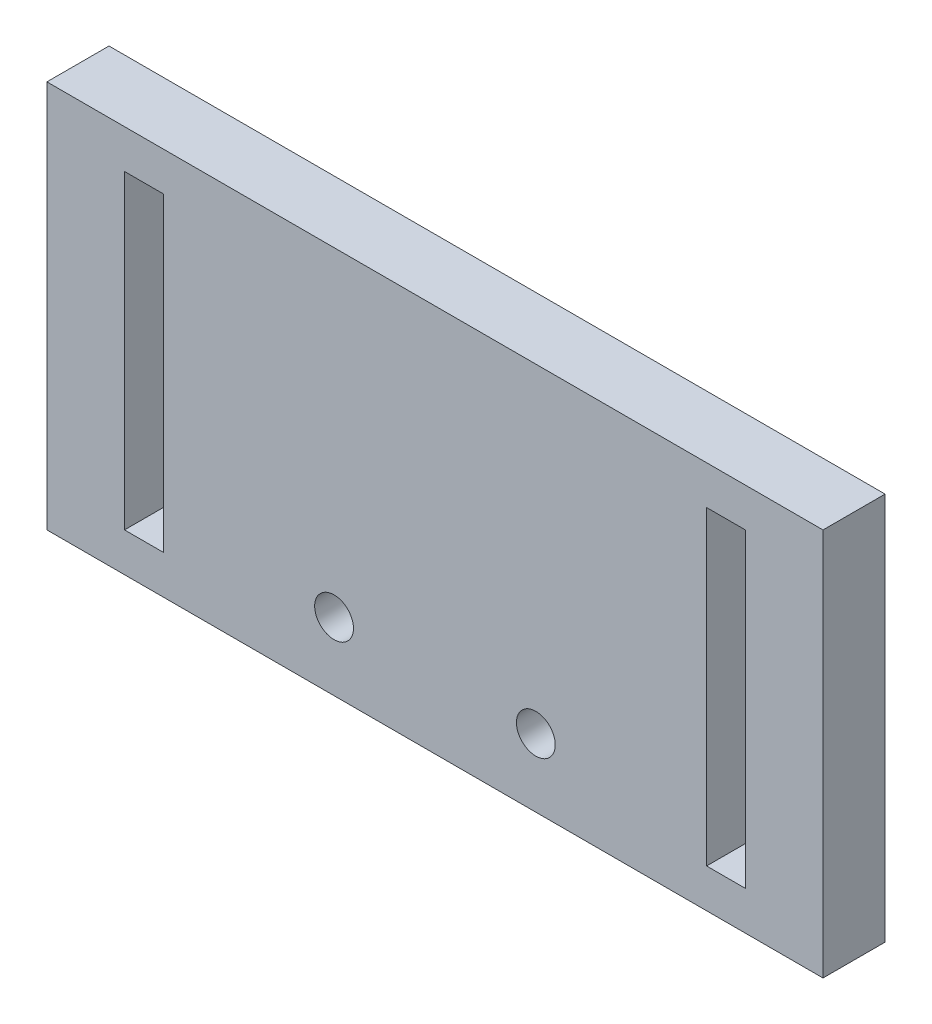
ISO-10303-21;
HEADER;
FILE_DESCRIPTION(('STEP AP214'),'2;1');
FILE_NAME('part.step','',(''),(''),'','','');
FILE_SCHEMA(('AUTOMOTIVE_DESIGN { 1 0 10303 214 1 1 1 1 }'));
ENDSEC;
DATA;
#1=APPLICATION_CONTEXT('core data for automotive mechanical design processes');
#2=APPLICATION_PROTOCOL_DEFINITION('international standard','automotive_design',2000,#1);
#3=PRODUCT_CONTEXT('',#1,'mechanical');
#4=PRODUCT('Part','Part','',(#3));
#5=PRODUCT_RELATED_PRODUCT_CATEGORY('part','',(#4));
#6=PRODUCT_DEFINITION_FORMATION('','',#4);
#7=PRODUCT_DEFINITION_CONTEXT('part definition',#1,'design');
#8=PRODUCT_DEFINITION('design','',#6,#7);
#9=PRODUCT_DEFINITION_SHAPE('','',#8);
#10=(LENGTH_UNIT() NAMED_UNIT(*) SI_UNIT(.MILLI.,.METRE.));
#11=(NAMED_UNIT(*) PLANE_ANGLE_UNIT() SI_UNIT($,.RADIAN.));
#12=(NAMED_UNIT(*) SI_UNIT($,.STERADIAN.) SOLID_ANGLE_UNIT());
#13=UNCERTAINTY_MEASURE_WITH_UNIT(LENGTH_MEASURE(1.E-05),#10,'distance_accuracy_value','');
#14=(GEOMETRIC_REPRESENTATION_CONTEXT(3) GLOBAL_UNCERTAINTY_ASSIGNED_CONTEXT((#13)) GLOBAL_UNIT_ASSIGNED_CONTEXT((#10,
#11,#12)) REPRESENTATION_CONTEXT('',''));
#15=CARTESIAN_POINT('',(0.,0.,0.));
#16=DIRECTION('',(0.,0.,1.));
#17=DIRECTION('',(1.,0.,0.));
#18=AXIS2_PLACEMENT_3D('',#15,#16,#17);
#19=CARTESIAN_POINT('',(0.,0.,8.));
#20=DIRECTION('',(0.,0.,1.));
#21=DIRECTION('',(1.,0.,0.));
#22=AXIS2_PLACEMENT_3D('',#19,#20,#21);
#23=PLANE('',#22);
#24=CARTESIAN_POINT('',(-13.,-16.2441684933035,8.));
#25=DIRECTION('',(0.,0.,1.));
#26=DIRECTION('',(1.,0.,0.));
#27=AXIS2_PLACEMENT_3D('',#24,#25,#26);
#28=CIRCLE('',#27,2.5);
#29=CARTESIAN_POINT('',(-10.5,-16.2441684933035,8.));
#30=VERTEX_POINT('',#29);
#31=EDGE_CURVE('E167',#30,#30,#28,.T.);
#32=ORIENTED_EDGE('',*,*,#31,.F.);
#33=EDGE_LOOP('',(#32));
#34=FACE_BOUND('',#33,.T.);
#35=DIRECTION('',(0.,-1.,0.));
#36=VECTOR('',#35,1.);
#37=CARTESIAN_POINT('',(-50.,-25.,8.));
#38=LINE('',#37,#36);
#39=CARTESIAN_POINT('',(-50.,25.,8.));
#40=VERTEX_POINT('',#39);
#41=CARTESIAN_POINT('',(-50.,-25.,8.));
#42=VERTEX_POINT('',#41);
#43=EDGE_CURVE('E226',#40,#42,#38,.T.);
#44=ORIENTED_EDGE('',*,*,#43,.T.);
#45=DIRECTION('',(1.,0.,0.));
#46=VECTOR('',#45,1.);
#47=CARTESIAN_POINT('',(50.,-25.,8.));
#48=LINE('',#47,#46);
#49=CARTESIAN_POINT('',(50.,-25.,8.));
#50=VERTEX_POINT('',#49);
#51=EDGE_CURVE('E230',#42,#50,#48,.T.);
#52=ORIENTED_EDGE('',*,*,#51,.T.);
#53=DIRECTION('',(0.,1.,0.));
#54=VECTOR('',#53,1.);
#55=CARTESIAN_POINT('',(50.,-25.,8.));
#56=LINE('',#55,#54);
#57=CARTESIAN_POINT('',(50.,25.,8.));
#58=VERTEX_POINT('',#57);
#59=EDGE_CURVE('E234',#50,#58,#56,.T.);
#60=ORIENTED_EDGE('',*,*,#59,.T.);
#61=DIRECTION('',(-1.,0.,0.));
#62=VECTOR('',#61,1.);
#63=CARTESIAN_POINT('',(50.,25.,8.));
#64=LINE('',#63,#62);
#65=EDGE_CURVE('E237',#58,#40,#64,.T.);
#66=ORIENTED_EDGE('',*,*,#65,.T.);
#67=EDGE_LOOP('',(#44,#52,#60,#66));
#68=FACE_BOUND('',#67,.T.);
#69=DIRECTION('',(1.,0.,0.));
#70=VECTOR('',#69,1.);
#71=CARTESIAN_POINT('',(-40.,-20.,8.));
#72=LINE('',#71,#70);
#73=CARTESIAN_POINT('',(-40.,-20.,8.));
#74=VERTEX_POINT('',#73);
#75=CARTESIAN_POINT('',(-35.,-20.,8.));
#76=VERTEX_POINT('',#75);
#77=EDGE_CURVE('E186',#74,#76,#72,.T.);
#78=ORIENTED_EDGE('',*,*,#77,.F.);
#79=DIRECTION('',(0.,-1.,0.));
#80=VECTOR('',#79,1.);
#81=CARTESIAN_POINT('',(-40.,20.,8.));
#82=LINE('',#81,#80);
#83=CARTESIAN_POINT('',(-40.,20.,8.));
#84=VERTEX_POINT('',#83);
#85=EDGE_CURVE('E183',#84,#74,#82,.T.);
#86=ORIENTED_EDGE('',*,*,#85,.F.);
#87=DIRECTION('',(-1.,0.,0.));
#88=VECTOR('',#87,1.);
#89=CARTESIAN_POINT('',(-40.,20.,8.));
#90=LINE('',#89,#88);
#91=CARTESIAN_POINT('',(-35.,20.,8.));
#92=VERTEX_POINT('',#91);
#93=EDGE_CURVE('E194',#92,#84,#90,.T.);
#94=ORIENTED_EDGE('',*,*,#93,.F.);
#95=DIRECTION('',(0.,1.,0.));
#96=VECTOR('',#95,1.);
#97=CARTESIAN_POINT('',(-35.,20.,8.));
#98=LINE('',#97,#96);
#99=EDGE_CURVE('E190',#76,#92,#98,.T.);
#100=ORIENTED_EDGE('',*,*,#99,.F.);
#101=EDGE_LOOP('',(#78,#86,#94,#100));
#102=FACE_BOUND('',#101,.T.);
#103=DIRECTION('',(0.,-1.,0.));
#104=VECTOR('',#103,1.);
#105=CARTESIAN_POINT('',(35.,20.,8.));
#106=LINE('',#105,#104);
#107=CARTESIAN_POINT('',(35.,20.,8.));
#108=VERTEX_POINT('',#107);
#109=CARTESIAN_POINT('',(35.,-20.,8.));
#110=VERTEX_POINT('',#109);
#111=EDGE_CURVE('E141',#108,#110,#106,.T.);
#112=ORIENTED_EDGE('',*,*,#111,.F.);
#113=DIRECTION('',(-1.,0.,0.));
#114=VECTOR('',#113,1.);
#115=CARTESIAN_POINT('',(40.,20.,8.));
#116=LINE('',#115,#114);
#117=CARTESIAN_POINT('',(40.,20.,8.));
#118=VERTEX_POINT('',#117);
#119=EDGE_CURVE('E132',#118,#108,#116,.T.);
#120=ORIENTED_EDGE('',*,*,#119,.F.);
#121=DIRECTION('',(0.,1.,0.));
#122=VECTOR('',#121,1.);
#123=CARTESIAN_POINT('',(40.,20.,8.));
#124=LINE('',#123,#122);
#125=CARTESIAN_POINT('',(40.,-20.,8.));
#126=VERTEX_POINT('',#125);
#127=EDGE_CURVE('E159',#126,#118,#124,.T.);
#128=ORIENTED_EDGE('',*,*,#127,.F.);
#129=DIRECTION('',(1.,0.,0.));
#130=VECTOR('',#129,1.);
#131=CARTESIAN_POINT('',(40.,-20.,8.));
#132=LINE('',#131,#130);
#133=EDGE_CURVE('E155',#110,#126,#132,.T.);
#134=ORIENTED_EDGE('',*,*,#133,.F.);
#135=EDGE_LOOP('',(#112,#120,#128,#134));
#136=FACE_BOUND('',#135,.T.);
#137=CARTESIAN_POINT('',(13.,-16.2441684933035,8.));
#138=DIRECTION('',(0.,0.,1.));
#139=DIRECTION('',(1.,0.,0.));
#140=AXIS2_PLACEMENT_3D('',#137,#138,#139);
#141=CIRCLE('',#140,2.5);
#142=CARTESIAN_POINT('',(15.5,-16.2441684933035,8.));
#143=VERTEX_POINT('',#142);
#144=EDGE_CURVE('E354',#143,#143,#141,.T.);
#145=ORIENTED_EDGE('',*,*,#144,.F.);
#146=EDGE_LOOP('',(#145));
#147=FACE_BOUND('',#146,.T.);
#148=ADVANCED_FACE('F42',(#34,#68,#102,#136,#147),#23,.T.);
#149=CARTESIAN_POINT('',(0.,0.,0.));
#150=DIRECTION('',(0.,0.,1.));
#151=DIRECTION('',(1.,0.,0.));
#152=AXIS2_PLACEMENT_3D('',#149,#150,#151);
#153=PLANE('',#152);
#154=DIRECTION('',(0.,-1.,0.));
#155=VECTOR('',#154,1.);
#156=CARTESIAN_POINT('',(-40.,20.,0.));
#157=LINE('',#156,#155);
#158=CARTESIAN_POINT('',(-40.,20.,0.));
#159=VERTEX_POINT('',#158);
#160=CARTESIAN_POINT('',(-40.,-20.,0.));
#161=VERTEX_POINT('',#160);
#162=EDGE_CURVE('E150',#159,#161,#157,.T.);
#163=ORIENTED_EDGE('',*,*,#162,.T.);
#164=DIRECTION('',(1.,0.,0.));
#165=VECTOR('',#164,1.);
#166=CARTESIAN_POINT('',(-40.,-20.,0.));
#167=LINE('',#166,#165);
#168=CARTESIAN_POINT('',(-35.,-20.,0.));
#169=VERTEX_POINT('',#168);
#170=EDGE_CURVE('E201',#161,#169,#167,.T.);
#171=ORIENTED_EDGE('',*,*,#170,.T.);
#172=DIRECTION('',(0.,1.,0.));
#173=VECTOR('',#172,1.);
#174=CARTESIAN_POINT('',(-35.,20.,0.));
#175=LINE('',#174,#173);
#176=CARTESIAN_POINT('',(-35.,20.,0.));
#177=VERTEX_POINT('',#176);
#178=EDGE_CURVE('E205',#169,#177,#175,.T.);
#179=ORIENTED_EDGE('',*,*,#178,.T.);
#180=DIRECTION('',(-1.,0.,0.));
#181=VECTOR('',#180,1.);
#182=CARTESIAN_POINT('',(-40.,20.,0.));
#183=LINE('',#182,#181);
#184=EDGE_CURVE('E187',#177,#159,#183,.T.);
#185=ORIENTED_EDGE('',*,*,#184,.T.);
#186=EDGE_LOOP('',(#163,#171,#179,#185));
#187=FACE_BOUND('',#186,.T.);
#188=DIRECTION('',(0.,-1.,0.));
#189=VECTOR('',#188,1.);
#190=CARTESIAN_POINT('',(-50.,-25.,0.));
#191=LINE('',#190,#189);
#192=CARTESIAN_POINT('',(-50.,25.,0.));
#193=VERTEX_POINT('',#192);
#194=CARTESIAN_POINT('',(-50.,-25.,0.));
#195=VERTEX_POINT('',#194);
#196=EDGE_CURVE('E225',#193,#195,#191,.T.);
#197=ORIENTED_EDGE('',*,*,#196,.F.);
#198=DIRECTION('',(-1.,0.,0.));
#199=VECTOR('',#198,1.);
#200=CARTESIAN_POINT('',(50.,25.,0.));
#201=LINE('',#200,#199);
#202=CARTESIAN_POINT('',(50.,25.,0.));
#203=VERTEX_POINT('',#202);
#204=EDGE_CURVE('E231',#203,#193,#201,.T.);
#205=ORIENTED_EDGE('',*,*,#204,.F.);
#206=DIRECTION('',(0.,1.,0.));
#207=VECTOR('',#206,1.);
#208=CARTESIAN_POINT('',(50.,-25.,0.));
#209=LINE('',#208,#207);
#210=CARTESIAN_POINT('',(50.,-25.,0.));
#211=VERTEX_POINT('',#210);
#212=EDGE_CURVE('E247',#211,#203,#209,.T.);
#213=ORIENTED_EDGE('',*,*,#212,.F.);
#214=DIRECTION('',(1.,0.,0.));
#215=VECTOR('',#214,1.);
#216=CARTESIAN_POINT('',(50.,-25.,0.));
#217=LINE('',#216,#215);
#218=EDGE_CURVE('E244',#195,#211,#217,.T.);
#219=ORIENTED_EDGE('',*,*,#218,.F.);
#220=EDGE_LOOP('',(#197,#205,#213,#219));
#221=FACE_BOUND('',#220,.T.);
#222=DIRECTION('',(-1.,0.,0.));
#223=VECTOR('',#222,1.);
#224=CARTESIAN_POINT('',(40.,20.,0.));
#225=LINE('',#224,#223);
#226=CARTESIAN_POINT('',(40.,20.,0.));
#227=VERTEX_POINT('',#226);
#228=CARTESIAN_POINT('',(35.,20.,0.));
#229=VERTEX_POINT('',#228);
#230=EDGE_CURVE('E66',#227,#229,#225,.T.);
#231=ORIENTED_EDGE('',*,*,#230,.T.);
#232=DIRECTION('',(0.,-1.,0.));
#233=VECTOR('',#232,1.);
#234=CARTESIAN_POINT('',(35.,20.,0.));
#235=LINE('',#234,#233);
#236=CARTESIAN_POINT('',(35.,-20.,0.));
#237=VERTEX_POINT('',#236);
#238=EDGE_CURVE('E148',#229,#237,#235,.T.);
#239=ORIENTED_EDGE('',*,*,#238,.T.);
#240=DIRECTION('',(1.,0.,0.));
#241=VECTOR('',#240,1.);
#242=CARTESIAN_POINT('',(40.,-20.,0.));
#243=LINE('',#242,#241);
#244=CARTESIAN_POINT('',(40.,-20.,0.));
#245=VERTEX_POINT('',#244);
#246=EDGE_CURVE('E170',#237,#245,#243,.T.);
#247=ORIENTED_EDGE('',*,*,#246,.T.);
#248=DIRECTION('',(0.,1.,0.));
#249=VECTOR('',#248,1.);
#250=CARTESIAN_POINT('',(40.,20.,0.));
#251=LINE('',#250,#249);
#252=EDGE_CURVE('E142',#245,#227,#251,.T.);
#253=ORIENTED_EDGE('',*,*,#252,.T.);
#254=EDGE_LOOP('',(#231,#239,#247,#253));
#255=FACE_BOUND('',#254,.T.);
#256=CARTESIAN_POINT('',(-13.,-16.2441684933035,0.));
#257=DIRECTION('',(0.,0.,1.));
#258=DIRECTION('',(1.,0.,0.));
#259=AXIS2_PLACEMENT_3D('',#256,#257,#258);
#260=CIRCLE('',#259,2.5);
#261=CARTESIAN_POINT('',(-10.5,-16.2441684933035,0.));
#262=VERTEX_POINT('',#261);
#263=EDGE_CURVE('E362',#262,#262,#260,.T.);
#264=ORIENTED_EDGE('',*,*,#263,.T.);
#265=EDGE_LOOP('',(#264));
#266=FACE_BOUND('',#265,.T.);
#267=CARTESIAN_POINT('',(13.,-16.2441684933035,0.));
#268=DIRECTION('',(0.,0.,1.));
#269=DIRECTION('',(1.,0.,0.));
#270=AXIS2_PLACEMENT_3D('',#267,#268,#269);
#271=CIRCLE('',#270,2.5);
#272=CARTESIAN_POINT('',(15.5,-16.2441684933035,0.));
#273=VERTEX_POINT('',#272);
#274=EDGE_CURVE('E357',#273,#273,#271,.T.);
#275=ORIENTED_EDGE('',*,*,#274,.T.);
#276=EDGE_LOOP('',(#275));
#277=FACE_BOUND('',#276,.T.);
#278=ADVANCED_FACE('F270',(#187,#221,#255,#266,#277),#153,.F.);
#279=CARTESIAN_POINT('',(-50.,-25.,8.));
#280=DIRECTION('',(1.,0.,0.));
#281=DIRECTION('',(0.,1.,0.));
#282=AXIS2_PLACEMENT_3D('',#279,#280,#281);
#283=PLANE('',#282);
#284=ORIENTED_EDGE('',*,*,#196,.T.);
#285=DIRECTION('',(0.,0.,-1.));
#286=VECTOR('',#285,1.);
#287=CARTESIAN_POINT('',(-50.,-25.,8.));
#288=LINE('',#287,#286);
#289=EDGE_CURVE('E11',#42,#195,#288,.T.);
#290=ORIENTED_EDGE('',*,*,#289,.F.);
#291=ORIENTED_EDGE('',*,*,#43,.F.);
#292=DIRECTION('',(0.,0.,-1.));
#293=VECTOR('',#292,1.);
#294=CARTESIAN_POINT('',(-50.,25.,8.));
#295=LINE('',#294,#293);
#296=EDGE_CURVE('E240',#40,#193,#295,.T.);
#297=ORIENTED_EDGE('',*,*,#296,.T.);
#298=EDGE_LOOP('',(#284,#290,#291,#297));
#299=FACE_BOUND('',#298,.T.);
#300=ADVANCED_FACE('F44',(#299),#283,.F.);
#301=CARTESIAN_POINT('',(50.,-25.,8.));
#302=DIRECTION('',(0.,1.,0.));
#303=DIRECTION('',(0.,0.,1.));
#304=AXIS2_PLACEMENT_3D('',#301,#302,#303);
#305=PLANE('',#304);
#306=ORIENTED_EDGE('',*,*,#218,.T.);
#307=DIRECTION('',(0.,0.,-1.));
#308=VECTOR('',#307,1.);
#309=CARTESIAN_POINT('',(50.,-25.,8.));
#310=LINE('',#309,#308);
#311=EDGE_CURVE('E51',#50,#211,#310,.T.);
#312=ORIENTED_EDGE('',*,*,#311,.F.);
#313=ORIENTED_EDGE('',*,*,#51,.F.);
#314=ORIENTED_EDGE('',*,*,#289,.T.);
#315=EDGE_LOOP('',(#306,#312,#313,#314));
#316=FACE_BOUND('',#315,.T.);
#317=ADVANCED_FACE('F281',(#316),#305,.F.);
#318=CARTESIAN_POINT('',(50.,-25.,8.));
#319=DIRECTION('',(-1.,0.,0.));
#320=DIRECTION('',(0.,-1.,0.));
#321=AXIS2_PLACEMENT_3D('',#318,#319,#320);
#322=PLANE('',#321);
#323=ORIENTED_EDGE('',*,*,#212,.T.);
#324=DIRECTION('',(0.,0.,-1.));
#325=VECTOR('',#324,1.);
#326=CARTESIAN_POINT('',(50.,25.,8.));
#327=LINE('',#326,#325);
#328=EDGE_CURVE('E255',#58,#203,#327,.T.);
#329=ORIENTED_EDGE('',*,*,#328,.F.);
#330=ORIENTED_EDGE('',*,*,#59,.F.);
#331=ORIENTED_EDGE('',*,*,#311,.T.);
#332=EDGE_LOOP('',(#323,#329,#330,#331));
#333=FACE_BOUND('',#332,.T.);
#334=ADVANCED_FACE('F264',(#333),#322,.F.);
#335=CARTESIAN_POINT('',(50.,25.,8.));
#336=DIRECTION('',(0.,-1.,0.));
#337=DIRECTION('',(1.,0.,0.));
#338=AXIS2_PLACEMENT_3D('',#335,#336,#337);
#339=PLANE('',#338);
#340=ORIENTED_EDGE('',*,*,#204,.T.);
#341=ORIENTED_EDGE('',*,*,#296,.F.);
#342=ORIENTED_EDGE('',*,*,#65,.F.);
#343=ORIENTED_EDGE('',*,*,#328,.T.);
#344=EDGE_LOOP('',(#340,#341,#342,#343));
#345=FACE_BOUND('',#344,.T.);
#346=ADVANCED_FACE('F274',(#345),#339,.F.);
#347=CARTESIAN_POINT('',(-40.,20.,8.));
#348=DIRECTION('',(1.,0.,0.));
#349=DIRECTION('',(0.,1.,0.));
#350=AXIS2_PLACEMENT_3D('',#347,#348,#349);
#351=PLANE('',#350);
#352=ORIENTED_EDGE('',*,*,#162,.F.);
#353=DIRECTION('',(0.,0.,-1.));
#354=VECTOR('',#353,1.);
#355=CARTESIAN_POINT('',(-40.,20.,8.));
#356=LINE('',#355,#354);
#357=EDGE_CURVE('E197',#84,#159,#356,.T.);
#358=ORIENTED_EDGE('',*,*,#357,.F.);
#359=ORIENTED_EDGE('',*,*,#85,.T.);
#360=DIRECTION('',(0.,0.,-1.));
#361=VECTOR('',#360,1.);
#362=CARTESIAN_POINT('',(-40.,-20.,8.));
#363=LINE('',#362,#361);
#364=EDGE_CURVE('E221',#74,#161,#363,.T.);
#365=ORIENTED_EDGE('',*,*,#364,.T.);
#366=EDGE_LOOP('',(#352,#358,#359,#365));
#367=FACE_BOUND('',#366,.T.);
#368=ADVANCED_FACE('F298',(#367),#351,.T.);
#369=CARTESIAN_POINT('',(-40.,-20.,8.));
#370=DIRECTION('',(0.,1.,0.));
#371=DIRECTION('',(0.,0.,1.));
#372=AXIS2_PLACEMENT_3D('',#369,#370,#371);
#373=PLANE('',#372);
#374=ORIENTED_EDGE('',*,*,#170,.F.);
#375=ORIENTED_EDGE('',*,*,#364,.F.);
#376=ORIENTED_EDGE('',*,*,#77,.T.);
#377=DIRECTION('',(0.,0.,-1.));
#378=VECTOR('',#377,1.);
#379=CARTESIAN_POINT('',(-35.,-20.,8.));
#380=LINE('',#379,#378);
#381=EDGE_CURVE('E218',#76,#169,#380,.T.);
#382=ORIENTED_EDGE('',*,*,#381,.T.);
#383=EDGE_LOOP('',(#374,#375,#376,#382));
#384=FACE_BOUND('',#383,.T.);
#385=ADVANCED_FACE('F305',(#384),#373,.T.);
#386=CARTESIAN_POINT('',(-35.,20.,8.));
#387=DIRECTION('',(-1.,0.,0.));
#388=DIRECTION('',(0.,-1.,0.));
#389=AXIS2_PLACEMENT_3D('',#386,#387,#388);
#390=PLANE('',#389);
#391=ORIENTED_EDGE('',*,*,#178,.F.);
#392=ORIENTED_EDGE('',*,*,#381,.F.);
#393=ORIENTED_EDGE('',*,*,#99,.T.);
#394=DIRECTION('',(0.,0.,-1.));
#395=VECTOR('',#394,1.);
#396=CARTESIAN_POINT('',(-35.,20.,8.));
#397=LINE('',#396,#395);
#398=EDGE_CURVE('E215',#92,#177,#397,.T.);
#399=ORIENTED_EDGE('',*,*,#398,.T.);
#400=EDGE_LOOP('',(#391,#392,#393,#399));
#401=FACE_BOUND('',#400,.T.);
#402=ADVANCED_FACE('F310',(#401),#390,.T.);
#403=CARTESIAN_POINT('',(-40.,20.,8.));
#404=DIRECTION('',(0.,-1.,0.));
#405=DIRECTION('',(1.,0.,0.));
#406=AXIS2_PLACEMENT_3D('',#403,#404,#405);
#407=PLANE('',#406);
#408=ORIENTED_EDGE('',*,*,#184,.F.);
#409=ORIENTED_EDGE('',*,*,#398,.F.);
#410=ORIENTED_EDGE('',*,*,#93,.T.);
#411=ORIENTED_EDGE('',*,*,#357,.T.);
#412=EDGE_LOOP('',(#408,#409,#410,#411));
#413=FACE_BOUND('',#412,.T.);
#414=ADVANCED_FACE('F317',(#413),#407,.T.);
#415=CARTESIAN_POINT('',(40.,20.,8.));
#416=DIRECTION('',(0.,-1.,0.));
#417=DIRECTION('',(1.,0.,0.));
#418=AXIS2_PLACEMENT_3D('',#415,#416,#417);
#419=PLANE('',#418);
#420=ORIENTED_EDGE('',*,*,#230,.F.);
#421=DIRECTION('',(0.,0.,-1.));
#422=VECTOR('',#421,1.);
#423=CARTESIAN_POINT('',(40.,20.,8.));
#424=LINE('',#423,#422);
#425=EDGE_CURVE('E136',#118,#227,#424,.T.);
#426=ORIENTED_EDGE('',*,*,#425,.F.);
#427=ORIENTED_EDGE('',*,*,#119,.T.);
#428=DIRECTION('',(0.,0.,-1.));
#429=VECTOR('',#428,1.);
#430=CARTESIAN_POINT('',(35.,20.,8.));
#431=LINE('',#430,#429);
#432=EDGE_CURVE('E135',#108,#229,#431,.T.);
#433=ORIENTED_EDGE('',*,*,#432,.T.);
#434=EDGE_LOOP('',(#420,#426,#427,#433));
#435=FACE_BOUND('',#434,.T.);
#436=ADVANCED_FACE('F134',(#435),#419,.T.);
#437=CARTESIAN_POINT('',(35.,20.,8.));
#438=DIRECTION('',(1.,0.,0.));
#439=DIRECTION('',(0.,1.,0.));
#440=AXIS2_PLACEMENT_3D('',#437,#438,#439);
#441=PLANE('',#440);
#442=ORIENTED_EDGE('',*,*,#238,.F.);
#443=ORIENTED_EDGE('',*,*,#432,.F.);
#444=ORIENTED_EDGE('',*,*,#111,.T.);
#445=DIRECTION('',(0.,0.,-1.));
#446=VECTOR('',#445,1.);
#447=CARTESIAN_POINT('',(35.,-20.,8.));
#448=LINE('',#447,#446);
#449=EDGE_CURVE('E151',#110,#237,#448,.T.);
#450=ORIENTED_EDGE('',*,*,#449,.T.);
#451=EDGE_LOOP('',(#442,#443,#444,#450));
#452=FACE_BOUND('',#451,.T.);
#453=ADVANCED_FACE('F145',(#452),#441,.T.);
#454=CARTESIAN_POINT('',(40.,-20.,8.));
#455=DIRECTION('',(0.,1.,0.));
#456=DIRECTION('',(0.,0.,1.));
#457=AXIS2_PLACEMENT_3D('',#454,#455,#456);
#458=PLANE('',#457);
#459=ORIENTED_EDGE('',*,*,#246,.F.);
#460=ORIENTED_EDGE('',*,*,#449,.F.);
#461=ORIENTED_EDGE('',*,*,#133,.T.);
#462=DIRECTION('',(0.,0.,-1.));
#463=VECTOR('',#462,1.);
#464=CARTESIAN_POINT('',(40.,-20.,8.));
#465=LINE('',#464,#463);
#466=EDGE_CURVE('E58',#126,#245,#465,.T.);
#467=ORIENTED_EDGE('',*,*,#466,.T.);
#468=EDGE_LOOP('',(#459,#460,#461,#467));
#469=FACE_BOUND('',#468,.T.);
#470=ADVANCED_FACE('F335',(#469),#458,.T.);
#471=CARTESIAN_POINT('',(40.,20.,8.));
#472=DIRECTION('',(-1.,0.,0.));
#473=DIRECTION('',(0.,-1.,0.));
#474=AXIS2_PLACEMENT_3D('',#471,#472,#473);
#475=PLANE('',#474);
#476=ORIENTED_EDGE('',*,*,#252,.F.);
#477=ORIENTED_EDGE('',*,*,#466,.F.);
#478=ORIENTED_EDGE('',*,*,#127,.T.);
#479=ORIENTED_EDGE('',*,*,#425,.T.);
#480=EDGE_LOOP('',(#476,#477,#478,#479));
#481=FACE_BOUND('',#480,.T.);
#482=ADVANCED_FACE('F338',(#481),#475,.T.);
#483=CARTESIAN_POINT('',(-13.,-16.2441684933035,8.));
#484=DIRECTION('',(0.,0.,-1.));
#485=DIRECTION('',(-1.,0.,0.));
#486=AXIS2_PLACEMENT_3D('',#483,#484,#485);
#487=CYLINDRICAL_SURFACE('',#486,2.5);
#488=ORIENTED_EDGE('',*,*,#31,.T.);
#489=EDGE_LOOP('',(#488));
#490=FACE_BOUND('',#489,.T.);
#491=ORIENTED_EDGE('',*,*,#263,.F.);
#492=EDGE_LOOP('',(#491));
#493=FACE_BOUND('',#492,.T.);
#494=ADVANCED_FACE('F342',(#490,#493),#487,.F.);
#495=CARTESIAN_POINT('',(13.,-16.2441684933035,8.));
#496=DIRECTION('',(0.,0.,-1.));
#497=DIRECTION('',(-1.,0.,0.));
#498=AXIS2_PLACEMENT_3D('',#495,#496,#497);
#499=CYLINDRICAL_SURFACE('',#498,2.5);
#500=ORIENTED_EDGE('',*,*,#144,.T.);
#501=EDGE_LOOP('',(#500));
#502=FACE_BOUND('',#501,.T.);
#503=ORIENTED_EDGE('',*,*,#274,.F.);
#504=EDGE_LOOP('',(#503));
#505=FACE_BOUND('',#504,.T.);
#506=ADVANCED_FACE('F345',(#502,#505),#499,.F.);
#507=CLOSED_SHELL('',(#148,#278,#300,#317,#334,#346,#368,#385,#402,#414,#436,#453,#470,#482,
#494,#506));
#508=MANIFOLD_SOLID_BREP('B2',#507);
#509=ADVANCED_BREP_SHAPE_REPRESENTATION('',(#18,#508),#14);
#510=SHAPE_DEFINITION_REPRESENTATION(#9,#509);
ENDSEC;
END-ISO-10303-21;
